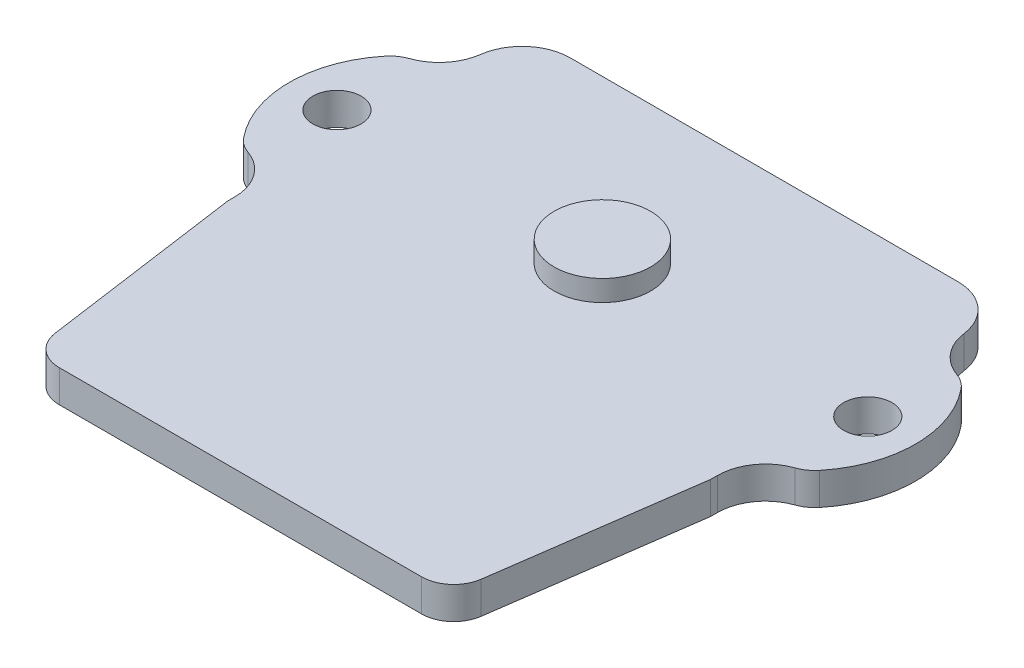
ISO-10303-21;
HEADER;
FILE_DESCRIPTION(('STEP AP214'),'2;1');
FILE_NAME('part.step','',(''),(''),'','','');
FILE_SCHEMA(('AUTOMOTIVE_DESIGN { 1 0 10303 214 1 1 1 1 }'));
ENDSEC;
DATA;
#1=APPLICATION_CONTEXT('core data for automotive mechanical design processes');
#2=APPLICATION_PROTOCOL_DEFINITION('international standard','automotive_design',2000,#1);
#3=PRODUCT_CONTEXT('',#1,'mechanical');
#4=PRODUCT('Part','Part','',(#3));
#5=PRODUCT_RELATED_PRODUCT_CATEGORY('part','',(#4));
#6=PRODUCT_DEFINITION_FORMATION('','',#4);
#7=PRODUCT_DEFINITION_CONTEXT('part definition',#1,'design');
#8=PRODUCT_DEFINITION('design','',#6,#7);
#9=PRODUCT_DEFINITION_SHAPE('','',#8);
#10=(LENGTH_UNIT() NAMED_UNIT(*) SI_UNIT(.MILLI.,.METRE.));
#11=(NAMED_UNIT(*) PLANE_ANGLE_UNIT() SI_UNIT($,.RADIAN.));
#12=(NAMED_UNIT(*) SI_UNIT($,.STERADIAN.) SOLID_ANGLE_UNIT());
#13=UNCERTAINTY_MEASURE_WITH_UNIT(LENGTH_MEASURE(1.E-05),#10,'distance_accuracy_value','');
#14=(GEOMETRIC_REPRESENTATION_CONTEXT(3) GLOBAL_UNCERTAINTY_ASSIGNED_CONTEXT((#13)) GLOBAL_UNIT_ASSIGNED_CONTEXT((#10,
#11,#12)) REPRESENTATION_CONTEXT('',''));
#15=CARTESIAN_POINT('',(0.,0.,0.));
#16=DIRECTION('',(0.,0.,1.));
#17=DIRECTION('',(1.,0.,0.));
#18=AXIS2_PLACEMENT_3D('',#15,#16,#17);
#19=CARTESIAN_POINT('',(0.,46.66,0.));
#20=DIRECTION('',(0.,-1.,0.));
#21=DIRECTION('',(0.,0.,-1.));
#22=AXIS2_PLACEMENT_3D('',#19,#20,#21);
#23=CYLINDRICAL_SURFACE('',#22,3.);
#24=CARTESIAN_POINT('',(0.,45.36,0.));
#25=DIRECTION('',(0.,1.,0.));
#26=DIRECTION('',(0.,0.,1.));
#27=AXIS2_PLACEMENT_3D('',#24,#25,#26);
#28=CIRCLE('',#27,3.);
#29=CARTESIAN_POINT('',(0.,45.36,3.));
#30=VERTEX_POINT('',#29);
#31=EDGE_CURVE('E322',#30,#30,#28,.T.);
#32=ORIENTED_EDGE('',*,*,#31,.T.);
#33=EDGE_LOOP('',(#32));
#34=FACE_BOUND('',#33,.T.);
#35=CARTESIAN_POINT('',(0.,46.66,0.));
#36=DIRECTION('',(0.,1.,0.));
#37=DIRECTION('',(0.,0.,1.));
#38=AXIS2_PLACEMENT_3D('',#35,#36,#37);
#39=CIRCLE('',#38,3.);
#40=CARTESIAN_POINT('',(0.,46.66,3.));
#41=VERTEX_POINT('',#40);
#42=EDGE_CURVE('E323',#41,#41,#39,.T.);
#43=ORIENTED_EDGE('',*,*,#42,.F.);
#44=EDGE_LOOP('',(#43));
#45=FACE_BOUND('',#44,.T.);
#46=ADVANCED_FACE('F161',(#34,#45),#23,.T.);
#47=CARTESIAN_POINT('',(15.,20.36,0.));
#48=DIRECTION('',(1.,0.,0.));
#49=DIRECTION('',(0.,0.,-1.));
#50=AXIS2_PLACEMENT_3D('',#47,#48,#49);
#51=PLANE('',#50);
#52=DIRECTION('',(0.,-1.,0.));
#53=VECTOR('',#52,1.);
#54=CARTESIAN_POINT('',(15.,39.36,8.26926055523136));
#55=LINE('',#54,#53);
#56=CARTESIAN_POINT('',(15.,45.36,8.26926055523136));
#57=VERTEX_POINT('',#56);
#58=CARTESIAN_POINT('',(15.,43.36,8.26926055523136));
#59=VERTEX_POINT('',#58);
#60=EDGE_CURVE('E507',#57,#59,#55,.T.);
#61=ORIENTED_EDGE('',*,*,#60,.T.);
#62=DIRECTION('',(0.,0.,1.));
#63=VECTOR('',#62,1.);
#64=CARTESIAN_POINT('',(15.,43.36,7.85811682275086));
#65=LINE('',#64,#63);
#66=CARTESIAN_POINT('',(15.,43.36,7.85811682275086));
#67=VERTEX_POINT('',#66);
#68=EDGE_CURVE('E412',#67,#59,#65,.T.);
#69=ORIENTED_EDGE('',*,*,#68,.F.);
#70=DIRECTION('',(0.,-1.,0.));
#71=VECTOR('',#70,1.);
#72=CARTESIAN_POINT('',(15.,45.36,7.85811682275086));
#73=LINE('',#72,#71);
#74=CARTESIAN_POINT('',(15.,45.36,7.85811682275086));
#75=VERTEX_POINT('',#74);
#76=EDGE_CURVE('E467',#67,#75,#73,.F.);
#77=ORIENTED_EDGE('',*,*,#76,.T.);
#78=DIRECTION('',(0.,0.,-1.));
#79=VECTOR('',#78,1.);
#80=CARTESIAN_POINT('',(15.,45.36,0.));
#81=LINE('',#80,#79);
#82=EDGE_CURVE('E463',#57,#75,#81,.T.);
#83=ORIENTED_EDGE('',*,*,#82,.F.);
#84=EDGE_LOOP('',(#61,#69,#77,#83));
#85=FACE_BOUND('',#84,.T.);
#86=ADVANCED_FACE('F537',(#85),#51,.T.);
#87=CARTESIAN_POINT('',(-15.,20.36,0.));
#88=DIRECTION('',(-1.,0.,0.));
#89=DIRECTION('',(0.,0.,1.));
#90=AXIS2_PLACEMENT_3D('',#87,#88,#89);
#91=PLANE('',#90);
#92=DIRECTION('',(0.,-1.,0.));
#93=VECTOR('',#92,1.);
#94=CARTESIAN_POINT('',(-15.,42.36,7.85811682275086));
#95=LINE('',#94,#93);
#96=CARTESIAN_POINT('',(-15.,45.36,7.85811682275086));
#97=VERTEX_POINT('',#96);
#98=CARTESIAN_POINT('',(-15.,43.36,7.85811682275086));
#99=VERTEX_POINT('',#98);
#100=EDGE_CURVE('E470',#97,#99,#95,.T.);
#101=ORIENTED_EDGE('',*,*,#100,.T.);
#102=DIRECTION('',(0.,0.,-1.));
#103=VECTOR('',#102,1.);
#104=CARTESIAN_POINT('',(-15.,43.36,8.26926055523166));
#105=LINE('',#104,#103);
#106=CARTESIAN_POINT('',(-15.,43.36,8.26926055523166));
#107=VERTEX_POINT('',#106);
#108=EDGE_CURVE('E422',#107,#99,#105,.T.);
#109=ORIENTED_EDGE('',*,*,#108,.F.);
#110=DIRECTION('',(0.,1.,0.));
#111=VECTOR('',#110,1.);
#112=CARTESIAN_POINT('',(-15.,45.36,8.26926055523166));
#113=LINE('',#112,#111);
#114=CARTESIAN_POINT('',(-15.,45.36,8.26926055523166));
#115=VERTEX_POINT('',#114);
#116=EDGE_CURVE('E336',#107,#115,#113,.T.);
#117=ORIENTED_EDGE('',*,*,#116,.T.);
#118=DIRECTION('',(0.,0.,1.));
#119=VECTOR('',#118,1.);
#120=CARTESIAN_POINT('',(-15.,45.36,0.));
#121=LINE('',#120,#119);
#122=EDGE_CURVE('E459',#97,#115,#121,.T.);
#123=ORIENTED_EDGE('',*,*,#122,.F.);
#124=EDGE_LOOP('',(#101,#109,#117,#123));
#125=FACE_BOUND('',#124,.T.);
#126=ADVANCED_FACE('F518',(#125),#91,.T.);
#127=CARTESIAN_POINT('',(16.5,42.36,0.));
#128=DIRECTION('',(0.,1.,0.));
#129=DIRECTION('',(0.,0.,1.));
#130=AXIS2_PLACEMENT_3D('',#127,#128,#129);
#131=CYLINDRICAL_SURFACE('',#130,1.5);
#132=CARTESIAN_POINT('',(16.5,45.36,0.));
#133=DIRECTION('',(0.,1.,0.));
#134=DIRECTION('',(0.,0.,1.));
#135=AXIS2_PLACEMENT_3D('',#132,#133,#134);
#136=CIRCLE('',#135,1.5);
#137=CARTESIAN_POINT('',(16.5,45.36,1.5));
#138=VERTEX_POINT('',#137);
#139=EDGE_CURVE('E455',#138,#138,#136,.T.);
#140=ORIENTED_EDGE('',*,*,#139,.T.);
#141=EDGE_LOOP('',(#140));
#142=FACE_BOUND('',#141,.T.);
#143=CARTESIAN_POINT('',(16.5,43.36,0.));
#144=DIRECTION('',(0.,-1.,0.));
#145=DIRECTION('',(0.,0.,-1.));
#146=AXIS2_PLACEMENT_3D('',#143,#144,#145);
#147=CIRCLE('',#146,1.5);
#148=CARTESIAN_POINT('',(16.5,43.36,-1.5));
#149=VERTEX_POINT('',#148);
#150=EDGE_CURVE('E432',#149,#149,#147,.F.);
#151=ORIENTED_EDGE('',*,*,#150,.F.);
#152=EDGE_LOOP('',(#151));
#153=FACE_BOUND('',#152,.T.);
#154=ADVANCED_FACE('F647',(#142,#153),#131,.F.);
#155=CARTESIAN_POINT('',(-16.5,42.36,0.));
#156=DIRECTION('',(0.,1.,0.));
#157=DIRECTION('',(0.,0.,1.));
#158=AXIS2_PLACEMENT_3D('',#155,#156,#157);
#159=CYLINDRICAL_SURFACE('',#158,1.5);
#160=CARTESIAN_POINT('',(-16.5,45.36,0.));
#161=DIRECTION('',(0.,1.,0.));
#162=DIRECTION('',(0.,0.,1.));
#163=AXIS2_PLACEMENT_3D('',#160,#161,#162);
#164=CIRCLE('',#163,1.5);
#165=CARTESIAN_POINT('',(-16.5,45.36,1.5));
#166=VERTEX_POINT('',#165);
#167=EDGE_CURVE('E451',#166,#166,#164,.T.);
#168=ORIENTED_EDGE('',*,*,#167,.T.);
#169=EDGE_LOOP('',(#168));
#170=FACE_BOUND('',#169,.T.);
#171=CARTESIAN_POINT('',(-16.5,43.36,0.));
#172=DIRECTION('',(0.,-1.,0.));
#173=DIRECTION('',(0.,0.,-1.));
#174=AXIS2_PLACEMENT_3D('',#171,#172,#173);
#175=CIRCLE('',#174,1.5);
#176=CARTESIAN_POINT('',(-16.5,43.36,-1.5));
#177=VERTEX_POINT('',#176);
#178=EDGE_CURVE('E428',#177,#177,#175,.F.);
#179=ORIENTED_EDGE('',*,*,#178,.F.);
#180=EDGE_LOOP('',(#179));
#181=FACE_BOUND('',#180,.T.);
#182=ADVANCED_FACE('F650',(#170,#181),#159,.F.);
#183=CARTESIAN_POINT('',(18.,42.36,7.85811682275085));
#184=DIRECTION('',(0.,1.,0.));
#185=DIRECTION('',(0.,0.,1.));
#186=AXIS2_PLACEMENT_3D('',#183,#184,#185);
#187=CYLINDRICAL_SURFACE('',#186,3.);
#188=CARTESIAN_POINT('',(18.,43.36,7.85811682275085));
#189=DIRECTION('',(0.,1.,0.));
#190=DIRECTION('',(0.,0.,-1.));
#191=AXIS2_PLACEMENT_3D('',#188,#189,#190);
#192=CIRCLE('',#191,3.00000000000003);
#193=CARTESIAN_POINT('',(17.0088496381766,43.36,5.02657643627259));
#194=VERTEX_POINT('',#193);
#195=EDGE_CURVE('E409',#194,#67,#192,.T.);
#196=ORIENTED_EDGE('',*,*,#195,.F.);
#197=DIRECTION('',(0.,1.,0.));
#198=VECTOR('',#197,1.);
#199=CARTESIAN_POINT('',(17.0088496381766,42.36,5.02657643627261));
#200=LINE('',#199,#198);
#201=CARTESIAN_POINT('',(17.0088496381766,45.36,5.02657643627261));
#202=VERTEX_POINT('',#201);
#203=EDGE_CURVE('E379',#194,#202,#200,.T.);
#204=ORIENTED_EDGE('',*,*,#203,.T.);
#205=CARTESIAN_POINT('',(18.,45.36,7.85811682275085));
#206=DIRECTION('',(0.,1.,0.));
#207=DIRECTION('',(0.,0.,1.));
#208=AXIS2_PLACEMENT_3D('',#205,#206,#207);
#209=CIRCLE('',#208,3.);
#210=EDGE_CURVE('E474',#75,#202,#209,.F.);
#211=ORIENTED_EDGE('',*,*,#210,.F.);
#212=ORIENTED_EDGE('',*,*,#76,.F.);
#213=EDGE_LOOP('',(#196,#204,#211,#212));
#214=FACE_BOUND('',#213,.T.);
#215=ADVANCED_FACE('F543',(#214),#187,.F.);
#216=CARTESIAN_POINT('',(18.,42.36,-7.85811682275086));
#217=DIRECTION('',(0.,1.,0.));
#218=DIRECTION('',(0.,0.,1.));
#219=AXIS2_PLACEMENT_3D('',#216,#217,#218);
#220=CYLINDRICAL_SURFACE('',#219,3.);
#221=CARTESIAN_POINT('',(18.,43.36,-7.85811682275086));
#222=DIRECTION('',(0.,1.,0.));
#223=DIRECTION('',(0.,0.,-1.));
#224=AXIS2_PLACEMENT_3D('',#221,#222,#223);
#225=CIRCLE('',#224,3.);
#226=CARTESIAN_POINT('',(15.0266322894142,43.36,-7.45926289253897));
#227=VERTEX_POINT('',#226);
#228=CARTESIAN_POINT('',(17.0088496381766,43.36,-5.02657643627262));
#229=VERTEX_POINT('',#228);
#230=EDGE_CURVE('E387',#227,#229,#225,.T.);
#231=ORIENTED_EDGE('',*,*,#230,.F.);
#232=DIRECTION('',(0.,1.,0.));
#233=VECTOR('',#232,1.);
#234=CARTESIAN_POINT('',(15.0266322894142,42.36,-7.45926289253897));
#235=LINE('',#234,#233);
#236=CARTESIAN_POINT('',(15.0266322894142,45.36,-7.45926289253897));
#237=VERTEX_POINT('',#236);
#238=EDGE_CURVE('E504',#227,#237,#235,.T.);
#239=ORIENTED_EDGE('',*,*,#238,.T.);
#240=CARTESIAN_POINT('',(18.,45.36,-7.85811682275086));
#241=DIRECTION('',(0.,1.,0.));
#242=DIRECTION('',(0.,0.,1.));
#243=AXIS2_PLACEMENT_3D('',#240,#241,#242);
#244=CIRCLE('',#243,3.);
#245=CARTESIAN_POINT('',(17.0088496381766,45.36,-5.02657643627262));
#246=VERTEX_POINT('',#245);
#247=EDGE_CURVE('E389',#246,#237,#244,.F.);
#248=ORIENTED_EDGE('',*,*,#247,.F.);
#249=DIRECTION('',(0.,1.,0.));
#250=VECTOR('',#249,1.);
#251=CARTESIAN_POINT('',(17.0088496381766,42.36,-5.02657643627262));
#252=LINE('',#251,#250);
#253=EDGE_CURVE('E170',#246,#229,#252,.F.);
#254=ORIENTED_EDGE('',*,*,#253,.T.);
#255=EDGE_LOOP('',(#231,#239,#248,#254));
#256=FACE_BOUND('',#255,.T.);
#257=ADVANCED_FACE('F386',(#256),#220,.F.);
#258=CARTESIAN_POINT('',(-18.,42.36,-7.85811682275085));
#259=DIRECTION('',(0.,1.,0.));
#260=DIRECTION('',(0.,0.,1.));
#261=AXIS2_PLACEMENT_3D('',#258,#259,#260);
#262=CYLINDRICAL_SURFACE('',#261,3.);
#263=CARTESIAN_POINT('',(-18.,43.36,-7.85811682275085));
#264=DIRECTION('',(0.,1.,0.));
#265=DIRECTION('',(0.,0.,-1.));
#266=AXIS2_PLACEMENT_3D('',#263,#264,#265);
#267=CIRCLE('',#266,3.);
#268=CARTESIAN_POINT('',(-17.0088496381766,43.36,-5.02657643627261));
#269=VERTEX_POINT('',#268);
#270=CARTESIAN_POINT('',(-15.0266322894142,43.36,-7.45926289253896));
#271=VERTEX_POINT('',#270);
#272=EDGE_CURVE('E609',#269,#271,#267,.T.);
#273=ORIENTED_EDGE('',*,*,#272,.F.);
#274=DIRECTION('',(0.,1.,0.));
#275=VECTOR('',#274,1.);
#276=CARTESIAN_POINT('',(-17.0088496381766,42.36,-5.02657643627261));
#277=LINE('',#276,#275);
#278=CARTESIAN_POINT('',(-17.0088496381766,45.36,-5.02657643627261));
#279=VERTEX_POINT('',#278);
#280=EDGE_CURVE('E12',#269,#279,#277,.T.);
#281=ORIENTED_EDGE('',*,*,#280,.T.);
#282=CARTESIAN_POINT('',(-18.,45.36,-7.85811682275085));
#283=DIRECTION('',(0.,1.,0.));
#284=DIRECTION('',(0.,0.,1.));
#285=AXIS2_PLACEMENT_3D('',#282,#283,#284);
#286=CIRCLE('',#285,3.);
#287=CARTESIAN_POINT('',(-15.0266322894142,45.36,-7.45926289253897));
#288=VERTEX_POINT('',#287);
#289=EDGE_CURVE('E480',#288,#279,#286,.F.);
#290=ORIENTED_EDGE('',*,*,#289,.F.);
#291=DIRECTION('',(0.,1.,0.));
#292=VECTOR('',#291,1.);
#293=CARTESIAN_POINT('',(-15.0266322894142,42.36,-7.45926289253897));
#294=LINE('',#293,#292);
#295=EDGE_CURVE('E487',#288,#271,#294,.F.);
#296=ORIENTED_EDGE('',*,*,#295,.T.);
#297=EDGE_LOOP('',(#273,#281,#290,#296));
#298=FACE_BOUND('',#297,.T.);
#299=ADVANCED_FACE('F607',(#298),#262,.F.);
#300=CARTESIAN_POINT('',(-18.,42.36,7.85811682275086));
#301=DIRECTION('',(0.,1.,0.));
#302=DIRECTION('',(0.,0.,1.));
#303=AXIS2_PLACEMENT_3D('',#300,#301,#302);
#304=CYLINDRICAL_SURFACE('',#303,3.);
#305=CARTESIAN_POINT('',(-18.,43.36,7.85811682275086));
#306=DIRECTION('',(0.,1.,0.));
#307=DIRECTION('',(0.,0.,-1.));
#308=AXIS2_PLACEMENT_3D('',#305,#306,#307);
#309=CIRCLE('',#308,3.);
#310=CARTESIAN_POINT('',(-17.0088496381766,43.36,5.02657643627262));
#311=VERTEX_POINT('',#310);
#312=EDGE_CURVE('E425',#99,#311,#309,.T.);
#313=ORIENTED_EDGE('',*,*,#312,.F.);
#314=ORIENTED_EDGE('',*,*,#100,.F.);
#315=CARTESIAN_POINT('',(-18.,45.36,7.85811682275086));
#316=DIRECTION('',(0.,1.,0.));
#317=DIRECTION('',(0.,0.,1.));
#318=AXIS2_PLACEMENT_3D('',#315,#316,#317);
#319=CIRCLE('',#318,3.);
#320=CARTESIAN_POINT('',(-17.0088496381766,45.36,5.02657643627262));
#321=VERTEX_POINT('',#320);
#322=EDGE_CURVE('E484',#321,#97,#319,.F.);
#323=ORIENTED_EDGE('',*,*,#322,.F.);
#324=DIRECTION('',(0.,1.,0.));
#325=VECTOR('',#324,1.);
#326=CARTESIAN_POINT('',(-17.0088496381766,42.36,5.02657643627262));
#327=LINE('',#326,#325);
#328=EDGE_CURVE('E368',#321,#311,#327,.F.);
#329=ORIENTED_EDGE('',*,*,#328,.T.);
#330=EDGE_LOOP('',(#313,#314,#323,#329));
#331=FACE_BOUND('',#330,.T.);
#332=ADVANCED_FACE('F636',(#331),#304,.F.);
#333=CARTESIAN_POINT('',(-15.,53.86,-10.0604089623271));
#334=DIRECTION('',(0.,0.,1.));
#335=DIRECTION('',(1.,0.,0.));
#336=AXIS2_PLACEMENT_3D('',#333,#334,#335);
#337=PLANE('',#336);
#338=DIRECTION('',(1.,0.,0.));
#339=VECTOR('',#338,1.);
#340=CARTESIAN_POINT('',(-12.0532645788283,43.36,-10.0604089623271));
#341=LINE('',#340,#339);
#342=CARTESIAN_POINT('',(-12.0532645788283,43.36,-10.0604089623271));
#343=VERTEX_POINT('',#342);
#344=CARTESIAN_POINT('',(12.0532645788283,43.36,-10.0604089623271));
#345=VERTEX_POINT('',#344);
#346=EDGE_CURVE('E620',#343,#345,#341,.T.);
#347=ORIENTED_EDGE('',*,*,#346,.F.);
#348=DIRECTION('',(0.,1.,0.));
#349=VECTOR('',#348,1.);
#350=CARTESIAN_POINT('',(-12.0532645788283,53.86,-10.0604089623271));
#351=LINE('',#350,#349);
#352=CARTESIAN_POINT('',(-12.0532645788283,45.36,-10.0604089623271));
#353=VERTEX_POINT('',#352);
#354=EDGE_CURVE('E495',#343,#353,#351,.T.);
#355=ORIENTED_EDGE('',*,*,#354,.T.);
#356=DIRECTION('',(1.,0.,0.));
#357=VECTOR('',#356,1.);
#358=CARTESIAN_POINT('',(0.,45.36,-10.0604089623271));
#359=LINE('',#358,#357);
#360=CARTESIAN_POINT('',(12.0532645788283,45.36,-10.0604089623271));
#361=VERTEX_POINT('',#360);
#362=EDGE_CURVE('E447',#353,#361,#359,.T.);
#363=ORIENTED_EDGE('',*,*,#362,.T.);
#364=DIRECTION('',(0.,1.,0.));
#365=VECTOR('',#364,1.);
#366=CARTESIAN_POINT('',(12.0532645788283,53.86,-10.0604089623271));
#367=LINE('',#366,#365);
#368=EDGE_CURVE('E491',#361,#345,#367,.F.);
#369=ORIENTED_EDGE('',*,*,#368,.T.);
#370=EDGE_LOOP('',(#347,#355,#363,#369));
#371=FACE_BOUND('',#370,.T.);
#372=ADVANCED_FACE('F634',(#371),#337,.F.);
#373=CARTESIAN_POINT('',(-12.0532645788283,42.36,-7.06040896232708));
#374=DIRECTION('',(0.,1.,0.));
#375=DIRECTION('',(0.,0.,1.));
#376=AXIS2_PLACEMENT_3D('',#373,#374,#375);
#377=CYLINDRICAL_SURFACE('',#376,3.);
#378=ORIENTED_EDGE('',*,*,#354,.F.);
#379=CARTESIAN_POINT('',(-12.0532645788283,43.36,-7.06040896232708));
#380=DIRECTION('',(0.,-1.,0.));
#381=DIRECTION('',(0.,0.,-1.));
#382=AXIS2_PLACEMENT_3D('',#379,#380,#381);
#383=CIRCLE('',#382,3.);
#384=EDGE_CURVE('E617',#271,#343,#383,.T.);
#385=ORIENTED_EDGE('',*,*,#384,.F.);
#386=ORIENTED_EDGE('',*,*,#295,.F.);
#387=CARTESIAN_POINT('',(-12.0532645788283,45.36,-7.06040896232708));
#388=DIRECTION('',(0.,1.,0.));
#389=DIRECTION('',(0.,0.,1.));
#390=AXIS2_PLACEMENT_3D('',#387,#388,#389);
#391=CIRCLE('',#390,3.);
#392=EDGE_CURVE('E501',#353,#288,#391,.T.);
#393=ORIENTED_EDGE('',*,*,#392,.F.);
#394=EDGE_LOOP('',(#378,#385,#386,#393));
#395=FACE_BOUND('',#394,.T.);
#396=ADVANCED_FACE('F615',(#395),#377,.T.);
#397=CARTESIAN_POINT('',(12.0532645788283,42.36,-7.06040896232708));
#398=DIRECTION('',(0.,1.,0.));
#399=DIRECTION('',(0.,0.,1.));
#400=AXIS2_PLACEMENT_3D('',#397,#398,#399);
#401=CYLINDRICAL_SURFACE('',#400,3.);
#402=ORIENTED_EDGE('',*,*,#238,.F.);
#403=CARTESIAN_POINT('',(12.0532645788283,43.36,-7.06040896232708));
#404=DIRECTION('',(0.,-1.,0.));
#405=DIRECTION('',(0.,0.,-1.));
#406=AXIS2_PLACEMENT_3D('',#403,#404,#405);
#407=CIRCLE('',#406,3.);
#408=EDGE_CURVE('E403',#345,#227,#407,.T.);
#409=ORIENTED_EDGE('',*,*,#408,.F.);
#410=ORIENTED_EDGE('',*,*,#368,.F.);
#411=CARTESIAN_POINT('',(12.0532645788283,45.36,-7.06040896232708));
#412=DIRECTION('',(0.,1.,0.));
#413=DIRECTION('',(0.,0.,1.));
#414=AXIS2_PLACEMENT_3D('',#411,#412,#413);
#415=CIRCLE('',#414,3.);
#416=EDGE_CURVE('E498',#237,#361,#415,.T.);
#417=ORIENTED_EDGE('',*,*,#416,.F.);
#418=EDGE_LOOP('',(#402,#409,#410,#417));
#419=FACE_BOUND('',#418,.T.);
#420=ADVANCED_FACE('F631',(#419),#401,.T.);
#421=CARTESIAN_POINT('',(15.,20.36,8.26926055523136));
#422=DIRECTION('',(0.99026806874157,0.,0.139173100960066));
#423=DIRECTION('',(0.,1.,0.));
#424=AXIS2_PLACEMENT_3D('',#421,#422,#423);
#425=PLANE('',#424);
#426=DIRECTION('',(0.,1.,0.));
#427=VECTOR('',#426,1.);
#428=CARTESIAN_POINT('',(13.2419626618507,39.36,20.7783462019201));
#429=LINE('',#428,#427);
#430=CARTESIAN_POINT('',(13.2419626618507,45.36,20.7783462019201));
#431=VERTEX_POINT('',#430);
#432=CARTESIAN_POINT('',(13.2419626618507,43.36,20.7783462019201));
#433=VERTEX_POINT('',#432);
#434=EDGE_CURVE('E347',#431,#433,#429,.F.);
#435=ORIENTED_EDGE('',*,*,#434,.T.);
#436=DIRECTION('',(-0.139173100960063,0.,0.990268068741571));
#437=VECTOR('',#436,1.);
#438=CARTESIAN_POINT('',(15.,43.36,8.26926055523136));
#439=LINE('',#438,#437);
#440=EDGE_CURVE('E306',#59,#433,#439,.T.);
#441=ORIENTED_EDGE('',*,*,#440,.F.);
#442=ORIENTED_EDGE('',*,*,#60,.F.);
#443=DIRECTION('',(0.139173100960066,0.,-0.99026806874157));
#444=VECTOR('',#443,1.);
#445=CARTESIAN_POINT('',(7.30436324621329,45.36,63.0265613075923));
#446=LINE('',#445,#444);
#447=EDGE_CURVE('E511',#431,#57,#446,.T.);
#448=ORIENTED_EDGE('',*,*,#447,.F.);
#449=EDGE_LOOP('',(#435,#441,#442,#448));
#450=FACE_BOUND('',#449,.T.);
#451=ADVANCED_FACE('F534',(#450),#425,.T.);
#452=CARTESIAN_POINT('',(-13.,53.86,22.5));
#453=DIRECTION('',(-0.99026806874157,0.,0.139173100960066));
#454=DIRECTION('',(0.,1.,0.));
#455=AXIS2_PLACEMENT_3D('',#452,#453,#454);
#456=PLANE('',#455);
#457=ORIENTED_EDGE('',*,*,#116,.F.);
#458=DIRECTION('',(-0.139173100960067,0.,-0.99026806874157));
#459=VECTOR('',#458,1.);
#460=CARTESIAN_POINT('',(-13.2419626618507,43.36,20.7783462019201));
#461=LINE('',#460,#459);
#462=CARTESIAN_POINT('',(-13.2419626618507,43.36,20.7783462019201));
#463=VERTEX_POINT('',#462);
#464=EDGE_CURVE('E419',#463,#107,#461,.T.);
#465=ORIENTED_EDGE('',*,*,#464,.F.);
#466=DIRECTION('',(0.,-1.,0.));
#467=VECTOR('',#466,1.);
#468=CARTESIAN_POINT('',(-13.2419626618507,45.36,20.7783462019201));
#469=LINE('',#468,#467);
#470=CARTESIAN_POINT('',(-13.2419626618507,45.36,20.7783462019201));
#471=VERTEX_POINT('',#470);
#472=EDGE_CURVE('E333',#463,#471,#469,.F.);
#473=ORIENTED_EDGE('',*,*,#472,.T.);
#474=DIRECTION('',(0.139173100960066,0.,0.99026806874157));
#475=VECTOR('',#474,1.);
#476=CARTESIAN_POINT('',(-7.3043632462133,45.36,63.0265613075923));
#477=LINE('',#476,#475);
#478=EDGE_CURVE('E329',#115,#471,#477,.T.);
#479=ORIENTED_EDGE('',*,*,#478,.F.);
#480=EDGE_LOOP('',(#457,#465,#473,#479));
#481=FACE_BOUND('',#480,.T.);
#482=ADVANCED_FACE('F526',(#481),#456,.T.);
#483=CARTESIAN_POINT('',(-12.5261769857807,53.86,0.));
#484=DIRECTION('',(0.,-1.,0.));
#485=DIRECTION('',(0.,0.,-1.));
#486=AXIS2_PLACEMENT_3D('',#483,#484,#485);
#487=CYLINDRICAL_SURFACE('',#486,6.94565961590403);
#488=DIRECTION('',(0.,-1.,0.));
#489=VECTOR('',#488,1.);
#490=CARTESIAN_POINT('',(-17.8936422881027,53.86,-4.40823136057646));
#491=LINE('',#490,#489);
#492=CARTESIAN_POINT('',(-17.8936422881027,45.36,-4.40823136057646));
#493=VERTEX_POINT('',#492);
#494=CARTESIAN_POINT('',(-17.8936422881027,43.36,-4.40823136057646));
#495=VERTEX_POINT('',#494);
#496=EDGE_CURVE('E350',#493,#495,#491,.T.);
#497=ORIENTED_EDGE('',*,*,#496,.T.);
#498=CARTESIAN_POINT('',(-12.5261769857807,43.36,0.));
#499=DIRECTION('',(0.,-1.,0.));
#500=DIRECTION('',(0.,0.,-1.));
#501=AXIS2_PLACEMENT_3D('',#498,#499,#500);
#502=CIRCLE('',#501,6.94565961590403);
#503=CARTESIAN_POINT('',(-17.8936422881027,43.36,4.40823136057647));
#504=VERTEX_POINT('',#503);
#505=EDGE_CURVE('E177',#504,#495,#502,.T.);
#506=ORIENTED_EDGE('',*,*,#505,.F.);
#507=DIRECTION('',(0.,-1.,0.));
#508=VECTOR('',#507,1.);
#509=CARTESIAN_POINT('',(-17.8936422881027,53.86,4.40823136057647));
#510=LINE('',#509,#508);
#511=CARTESIAN_POINT('',(-17.8936422881027,45.36,4.40823136057647));
#512=VERTEX_POINT('',#511);
#513=EDGE_CURVE('E354',#504,#512,#510,.F.);
#514=ORIENTED_EDGE('',*,*,#513,.T.);
#515=CARTESIAN_POINT('',(-12.5261769857807,45.36,0.));
#516=DIRECTION('',(0.,1.,0.));
#517=DIRECTION('',(0.,0.,1.));
#518=AXIS2_PLACEMENT_3D('',#515,#516,#517);
#519=CIRCLE('',#518,6.94565961590403);
#520=EDGE_CURVE('E436',#493,#512,#519,.T.);
#521=ORIENTED_EDGE('',*,*,#520,.F.);
#522=EDGE_LOOP('',(#497,#506,#514,#521));
#523=FACE_BOUND('',#522,.T.);
#524=ADVANCED_FACE('F553',(#523),#487,.T.);
#525=CARTESIAN_POINT('',(12.5261769857807,53.86,0.));
#526=DIRECTION('',(0.,-1.,0.));
#527=DIRECTION('',(0.,0.,-1.));
#528=AXIS2_PLACEMENT_3D('',#525,#526,#527);
#529=CYLINDRICAL_SURFACE('',#528,6.94565961590403);
#530=CARTESIAN_POINT('',(12.5261769857807,43.36,0.));
#531=DIRECTION('',(0.,-1.,0.));
#532=DIRECTION('',(0.,0.,-1.));
#533=AXIS2_PLACEMENT_3D('',#530,#531,#532);
#534=CIRCLE('',#533,6.94565961590403);
#535=CARTESIAN_POINT('',(17.8936422881027,43.36,-4.40823136057648));
#536=VERTEX_POINT('',#535);
#537=CARTESIAN_POINT('',(17.8936422881027,43.36,4.40823136057646));
#538=VERTEX_POINT('',#537);
#539=EDGE_CURVE('E397',#536,#538,#534,.T.);
#540=ORIENTED_EDGE('',*,*,#539,.F.);
#541=DIRECTION('',(0.,-1.,0.));
#542=VECTOR('',#541,1.);
#543=CARTESIAN_POINT('',(17.8936422881027,53.86,-4.40823136057648));
#544=LINE('',#543,#542);
#545=CARTESIAN_POINT('',(17.8936422881027,45.36,-4.40823136057648));
#546=VERTEX_POINT('',#545);
#547=EDGE_CURVE('E372',#536,#546,#544,.F.);
#548=ORIENTED_EDGE('',*,*,#547,.T.);
#549=CARTESIAN_POINT('',(12.5261769857807,45.36,0.));
#550=DIRECTION('',(0.,1.,0.));
#551=DIRECTION('',(0.,0.,1.));
#552=AXIS2_PLACEMENT_3D('',#549,#550,#551);
#553=CIRCLE('',#552,6.94565961590403);
#554=CARTESIAN_POINT('',(17.8936422881027,45.36,4.40823136057647));
#555=VERTEX_POINT('',#554);
#556=EDGE_CURVE('E440',#546,#555,#553,.F.);
#557=ORIENTED_EDGE('',*,*,#556,.T.);
#558=DIRECTION('',(0.,-1.,0.));
#559=VECTOR('',#558,1.);
#560=CARTESIAN_POINT('',(17.8936422881027,53.86,4.40823136057647));
#561=LINE('',#560,#559);
#562=EDGE_CURVE('E375',#555,#538,#561,.T.);
#563=ORIENTED_EDGE('',*,*,#562,.T.);
#564=EDGE_LOOP('',(#540,#548,#557,#563));
#565=FACE_BOUND('',#564,.T.);
#566=ADVANCED_FACE('F550',(#565),#529,.T.);
#567=CARTESIAN_POINT('',(-16.3480827302943,42.36,3.13888284528712));
#568=DIRECTION('',(0.,-1.,0.));
#569=DIRECTION('',(0.,0.,-1.));
#570=AXIS2_PLACEMENT_3D('',#567,#568,#569);
#571=CYLINDRICAL_SURFACE('',#570,2.);
#572=ORIENTED_EDGE('',*,*,#513,.F.);
#573=CARTESIAN_POINT('',(-16.3480827302943,43.36,3.13888284528712));
#574=DIRECTION('',(0.,-1.,0.));
#575=DIRECTION('',(0.,0.,-1.));
#576=AXIS2_PLACEMENT_3D('',#573,#574,#575);
#577=CIRCLE('',#576,2.);
#578=EDGE_CURVE('E953',#311,#504,#577,.T.);
#579=ORIENTED_EDGE('',*,*,#578,.F.);
#580=ORIENTED_EDGE('',*,*,#328,.F.);
#581=CARTESIAN_POINT('',(-16.3480827302943,45.36,3.13888284528712));
#582=DIRECTION('',(0.,1.,0.));
#583=DIRECTION('',(0.,0.,1.));
#584=AXIS2_PLACEMENT_3D('',#581,#582,#583);
#585=CIRCLE('',#584,2.);
#586=EDGE_CURVE('E365',#512,#321,#585,.T.);
#587=ORIENTED_EDGE('',*,*,#586,.F.);
#588=EDGE_LOOP('',(#572,#579,#580,#587));
#589=FACE_BOUND('',#588,.T.);
#590=ADVANCED_FACE('F552',(#589),#571,.T.);
#591=CARTESIAN_POINT('',(16.3480827302943,42.36,3.13888284528713));
#592=DIRECTION('',(0.,1.,0.));
#593=DIRECTION('',(0.,0.,1.));
#594=AXIS2_PLACEMENT_3D('',#591,#592,#593);
#595=CYLINDRICAL_SURFACE('',#594,2.);
#596=ORIENTED_EDGE('',*,*,#203,.F.);
#597=CARTESIAN_POINT('',(16.3480827302943,43.36,3.13888284528713));
#598=DIRECTION('',(0.,-1.,0.));
#599=DIRECTION('',(0.,0.,-1.));
#600=AXIS2_PLACEMENT_3D('',#597,#598,#599);
#601=CIRCLE('',#600,1.99999999999999);
#602=EDGE_CURVE('E401',#538,#194,#601,.T.);
#603=ORIENTED_EDGE('',*,*,#602,.F.);
#604=ORIENTED_EDGE('',*,*,#562,.F.);
#605=CARTESIAN_POINT('',(16.3480827302943,45.36,3.13888284528713));
#606=DIRECTION('',(0.,1.,0.));
#607=DIRECTION('',(0.,0.,1.));
#608=AXIS2_PLACEMENT_3D('',#605,#606,#607);
#609=CIRCLE('',#608,2.);
#610=EDGE_CURVE('E362',#202,#555,#609,.T.);
#611=ORIENTED_EDGE('',*,*,#610,.F.);
#612=EDGE_LOOP('',(#596,#603,#604,#611));
#613=FACE_BOUND('',#612,.T.);
#614=ADVANCED_FACE('F547',(#613),#595,.T.);
#615=CARTESIAN_POINT('',(16.3480827302943,42.36,-3.13888284528713));
#616=DIRECTION('',(0.,-1.,0.));
#617=DIRECTION('',(0.,0.,-1.));
#618=AXIS2_PLACEMENT_3D('',#615,#616,#617);
#619=CYLINDRICAL_SURFACE('',#618,2.);
#620=ORIENTED_EDGE('',*,*,#547,.F.);
#621=CARTESIAN_POINT('',(16.3480827302943,43.36,-3.13888284528713));
#622=DIRECTION('',(0.,-1.,0.));
#623=DIRECTION('',(0.,0.,-1.));
#624=AXIS2_PLACEMENT_3D('',#621,#622,#623);
#625=CIRCLE('',#624,2.);
#626=EDGE_CURVE('E394',#229,#536,#625,.T.);
#627=ORIENTED_EDGE('',*,*,#626,.F.);
#628=ORIENTED_EDGE('',*,*,#253,.F.);
#629=CARTESIAN_POINT('',(16.3480827302943,45.36,-3.13888284528713));
#630=DIRECTION('',(0.,1.,0.));
#631=DIRECTION('',(0.,0.,1.));
#632=AXIS2_PLACEMENT_3D('',#629,#630,#631);
#633=CIRCLE('',#632,2.);
#634=EDGE_CURVE('E185',#546,#246,#633,.T.);
#635=ORIENTED_EDGE('',*,*,#634,.F.);
#636=EDGE_LOOP('',(#620,#627,#628,#635));
#637=FACE_BOUND('',#636,.T.);
#638=ADVANCED_FACE('F393',(#637),#619,.T.);
#639=CARTESIAN_POINT('',(-16.3480827302943,42.36,-3.13888284528712));
#640=DIRECTION('',(0.,1.,0.));
#641=DIRECTION('',(0.,0.,1.));
#642=AXIS2_PLACEMENT_3D('',#639,#640,#641);
#643=CYLINDRICAL_SURFACE('',#642,2.);
#644=ORIENTED_EDGE('',*,*,#280,.F.);
#645=CARTESIAN_POINT('',(-16.3480827302943,43.36,-3.13888284528712));
#646=DIRECTION('',(0.,-1.,0.));
#647=DIRECTION('',(0.,0.,-1.));
#648=AXIS2_PLACEMENT_3D('',#645,#646,#647);
#649=CIRCLE('',#648,2.);
#650=EDGE_CURVE('E603',#495,#269,#649,.T.);
#651=ORIENTED_EDGE('',*,*,#650,.F.);
#652=ORIENTED_EDGE('',*,*,#496,.F.);
#653=CARTESIAN_POINT('',(-16.3480827302943,45.36,-3.13888284528712));
#654=DIRECTION('',(0.,1.,0.));
#655=DIRECTION('',(0.,0.,1.));
#656=AXIS2_PLACEMENT_3D('',#653,#654,#655);
#657=CIRCLE('',#656,2.);
#658=EDGE_CURVE('E357',#279,#493,#657,.T.);
#659=ORIENTED_EDGE('',*,*,#658,.F.);
#660=EDGE_LOOP('',(#644,#651,#652,#659));
#661=FACE_BOUND('',#660,.T.);
#662=ADVANCED_FACE('F163',(#661),#643,.T.);
#663=CARTESIAN_POINT('',(0.,45.36,62.));
#664=DIRECTION('',(0.,1.,0.));
#665=DIRECTION('',(0.,0.,1.));
#666=AXIS2_PLACEMENT_3D('',#663,#664,#665);
#667=PLANE('',#666);
#668=ORIENTED_EDGE('',*,*,#31,.F.);
#669=EDGE_LOOP('',(#668));
#670=FACE_BOUND('',#669,.T.);
#671=ORIENTED_EDGE('',*,*,#139,.F.);
#672=EDGE_LOOP('',(#671));
#673=FACE_BOUND('',#672,.T.);
#674=ORIENTED_EDGE('',*,*,#167,.F.);
#675=EDGE_LOOP('',(#674));
#676=FACE_BOUND('',#675,.T.);
#677=ORIENTED_EDGE('',*,*,#520,.T.);
#678=ORIENTED_EDGE('',*,*,#586,.T.);
#679=ORIENTED_EDGE('',*,*,#322,.T.);
#680=ORIENTED_EDGE('',*,*,#122,.T.);
#681=ORIENTED_EDGE('',*,*,#478,.T.);
#682=CARTESIAN_POINT('',(-11.2614265243675,45.36,20.5));
#683=DIRECTION('',(0.,1.,0.));
#684=DIRECTION('',(0.,0.,1.));
#685=AXIS2_PLACEMENT_3D('',#682,#683,#684);
#686=CIRCLE('',#685,2.);
#687=CARTESIAN_POINT('',(-11.2614265243675,45.36,22.5));
#688=VERTEX_POINT('',#687);
#689=EDGE_CURVE('E344',#471,#688,#686,.T.);
#690=ORIENTED_EDGE('',*,*,#689,.T.);
#691=DIRECTION('',(-1.,0.,0.));
#692=VECTOR('',#691,1.);
#693=CARTESIAN_POINT('',(0.,45.36,22.5));
#694=LINE('',#693,#692);
#695=CARTESIAN_POINT('',(11.2614265243675,45.36,22.5));
#696=VERTEX_POINT('',#695);
#697=EDGE_CURVE('E444',#696,#688,#694,.T.);
#698=ORIENTED_EDGE('',*,*,#697,.F.);
#699=CARTESIAN_POINT('',(11.2614265243675,45.36,20.5));
#700=DIRECTION('',(0.,1.,0.));
#701=DIRECTION('',(0.,0.,1.));
#702=AXIS2_PLACEMENT_3D('',#699,#700,#701);
#703=CIRCLE('',#702,2.);
#704=EDGE_CURVE('E326',#696,#431,#703,.T.);
#705=ORIENTED_EDGE('',*,*,#704,.T.);
#706=ORIENTED_EDGE('',*,*,#447,.T.);
#707=ORIENTED_EDGE('',*,*,#82,.T.);
#708=ORIENTED_EDGE('',*,*,#210,.T.);
#709=ORIENTED_EDGE('',*,*,#610,.T.);
#710=ORIENTED_EDGE('',*,*,#556,.F.);
#711=ORIENTED_EDGE('',*,*,#634,.T.);
#712=ORIENTED_EDGE('',*,*,#247,.T.);
#713=ORIENTED_EDGE('',*,*,#416,.T.);
#714=ORIENTED_EDGE('',*,*,#362,.F.);
#715=ORIENTED_EDGE('',*,*,#392,.T.);
#716=ORIENTED_EDGE('',*,*,#289,.T.);
#717=ORIENTED_EDGE('',*,*,#658,.T.);
#718=EDGE_LOOP('',(#677,#678,#679,#680,#681,#690,#698,#705,#706,#707,#708,#709,#710,#711,#712,
#713,#714,#715,#716,#717));
#719=FACE_BOUND('',#718,.T.);
#720=ADVANCED_FACE('F523',(#670,#673,#676,#719),#667,.T.);
#721=CARTESIAN_POINT('',(15.,53.86,22.5));
#722=DIRECTION('',(0.,0.,-1.));
#723=DIRECTION('',(-1.,0.,0.));
#724=AXIS2_PLACEMENT_3D('',#721,#722,#723);
#725=PLANE('',#724);
#726=DIRECTION('',(0.,-1.,0.));
#727=VECTOR('',#726,1.);
#728=CARTESIAN_POINT('',(-11.2614265243675,39.36,22.5));
#729=LINE('',#728,#727);
#730=CARTESIAN_POINT('',(-11.2614265243675,43.36,22.5));
#731=VERTEX_POINT('',#730);
#732=EDGE_CURVE('E320',#688,#731,#729,.T.);
#733=ORIENTED_EDGE('',*,*,#732,.T.);
#734=DIRECTION('',(1.,0.,0.));
#735=VECTOR('',#734,1.);
#736=CARTESIAN_POINT('',(15.,43.36,22.5));
#737=LINE('',#736,#735);
#738=CARTESIAN_POINT('',(11.2614265243675,43.36,22.5));
#739=VERTEX_POINT('',#738);
#740=EDGE_CURVE('E303',#731,#739,#737,.T.);
#741=ORIENTED_EDGE('',*,*,#740,.T.);
#742=DIRECTION('',(0.,1.,0.));
#743=VECTOR('',#742,1.);
#744=CARTESIAN_POINT('',(11.2614265243675,45.36,22.5));
#745=LINE('',#744,#743);
#746=EDGE_CURVE('E317',#739,#696,#745,.T.);
#747=ORIENTED_EDGE('',*,*,#746,.T.);
#748=ORIENTED_EDGE('',*,*,#697,.T.);
#749=EDGE_LOOP('',(#733,#741,#747,#748));
#750=FACE_BOUND('',#749,.T.);
#751=ADVANCED_FACE('F315',(#750),#725,.F.);
#752=CARTESIAN_POINT('',(-11.2614265243675,53.86,20.5));
#753=DIRECTION('',(0.,1.,0.));
#754=DIRECTION('',(0.,0.,1.));
#755=AXIS2_PLACEMENT_3D('',#752,#753,#754);
#756=CYLINDRICAL_SURFACE('',#755,2.);
#757=CARTESIAN_POINT('',(-11.2614265243675,43.36,20.5));
#758=DIRECTION('',(0.,-1.,0.));
#759=DIRECTION('',(0.,0.,-1.));
#760=AXIS2_PLACEMENT_3D('',#757,#758,#759);
#761=CIRCLE('',#760,2.);
#762=EDGE_CURVE('E312',#731,#463,#761,.T.);
#763=ORIENTED_EDGE('',*,*,#762,.F.);
#764=ORIENTED_EDGE('',*,*,#732,.F.);
#765=ORIENTED_EDGE('',*,*,#689,.F.);
#766=ORIENTED_EDGE('',*,*,#472,.F.);
#767=EDGE_LOOP('',(#763,#764,#765,#766));
#768=FACE_BOUND('',#767,.T.);
#769=ADVANCED_FACE('F529',(#768),#756,.T.);
#770=CARTESIAN_POINT('',(11.2614265243675,53.86,20.5));
#771=DIRECTION('',(0.,-1.,0.));
#772=DIRECTION('',(0.,0.,-1.));
#773=AXIS2_PLACEMENT_3D('',#770,#771,#772);
#774=CYLINDRICAL_SURFACE('',#773,2.);
#775=ORIENTED_EDGE('',*,*,#746,.F.);
#776=CARTESIAN_POINT('',(11.2614265243675,43.36,20.5));
#777=DIRECTION('',(0.,-1.,0.));
#778=DIRECTION('',(0.,0.,-1.));
#779=AXIS2_PLACEMENT_3D('',#776,#777,#778);
#780=CIRCLE('',#779,2.);
#781=EDGE_CURVE('E299',#433,#739,#780,.T.);
#782=ORIENTED_EDGE('',*,*,#781,.F.);
#783=ORIENTED_EDGE('',*,*,#434,.F.);
#784=ORIENTED_EDGE('',*,*,#704,.F.);
#785=EDGE_LOOP('',(#775,#782,#783,#784));
#786=FACE_BOUND('',#785,.T.);
#787=ADVANCED_FACE('F325',(#786),#774,.T.);
#788=CARTESIAN_POINT('',(-16.3480827302943,43.36,3.13888284528712));
#789=DIRECTION('',(0.,-1.,0.));
#790=DIRECTION('',(0.,0.,-1.));
#791=AXIS2_PLACEMENT_3D('',#788,#789,#790);
#792=PLANE('',#791);
#793=ORIENTED_EDGE('',*,*,#781,.T.);
#794=ORIENTED_EDGE('',*,*,#740,.F.);
#795=ORIENTED_EDGE('',*,*,#762,.T.);
#796=ORIENTED_EDGE('',*,*,#464,.T.);
#797=ORIENTED_EDGE('',*,*,#108,.T.);
#798=ORIENTED_EDGE('',*,*,#312,.T.);
#799=ORIENTED_EDGE('',*,*,#578,.T.);
#800=ORIENTED_EDGE('',*,*,#505,.T.);
#801=ORIENTED_EDGE('',*,*,#650,.T.);
#802=ORIENTED_EDGE('',*,*,#272,.T.);
#803=ORIENTED_EDGE('',*,*,#384,.T.);
#804=ORIENTED_EDGE('',*,*,#346,.T.);
#805=ORIENTED_EDGE('',*,*,#408,.T.);
#806=ORIENTED_EDGE('',*,*,#230,.T.);
#807=ORIENTED_EDGE('',*,*,#626,.T.);
#808=ORIENTED_EDGE('',*,*,#539,.T.);
#809=ORIENTED_EDGE('',*,*,#602,.T.);
#810=ORIENTED_EDGE('',*,*,#195,.T.);
#811=ORIENTED_EDGE('',*,*,#68,.T.);
#812=ORIENTED_EDGE('',*,*,#440,.T.);
#813=EDGE_LOOP('',(#793,#794,#795,#796,#797,#798,#799,#800,#801,#802,#803,#804,#805,#806,#807,
#808,#809,#810,#811,#812));
#814=FACE_BOUND('',#813,.T.);
#815=ORIENTED_EDGE('',*,*,#178,.T.);
#816=EDGE_LOOP('',(#815));
#817=FACE_BOUND('',#816,.T.);
#818=ORIENTED_EDGE('',*,*,#150,.T.);
#819=EDGE_LOOP('',(#818));
#820=FACE_BOUND('',#819,.T.);
#821=ADVANCED_FACE('F301',(#814,#817,#820),#792,.T.);
#822=CARTESIAN_POINT('',(0.,46.66,0.));
#823=DIRECTION('',(0.,1.,0.));
#824=DIRECTION('',(0.,0.,1.));
#825=AXIS2_PLACEMENT_3D('',#822,#823,#824);
#826=PLANE('',#825);
#827=ORIENTED_EDGE('',*,*,#42,.T.);
#828=EDGE_LOOP('',(#827));
#829=FACE_BOUND('',#828,.T.);
#830=ADVANCED_FACE('F577',(#829),#826,.T.);
#831=CLOSED_SHELL('',(#46,#86,#126,#154,#182,#215,#257,#299,#332,#372,#396,#420,#451,#482,#524,
#566,#590,#614,#638,#662,#720,#751,#769,#787,#821,#830));
#832=MANIFOLD_SOLID_BREP('B2',#831);
#833=ADVANCED_BREP_SHAPE_REPRESENTATION('',(#18,#832),#14);
#834=SHAPE_DEFINITION_REPRESENTATION(#9,#833);
ENDSEC;
END-ISO-10303-21;
